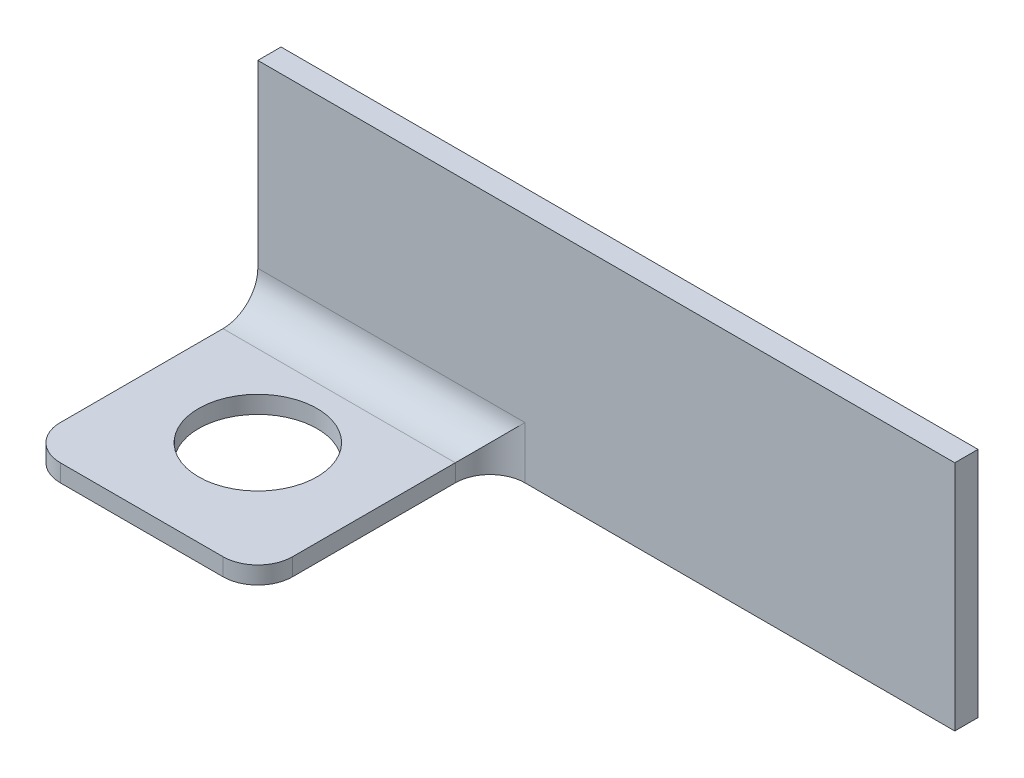
ISO-10303-21;
HEADER;
FILE_DESCRIPTION(('STEP AP214'),'2;1');
FILE_NAME('part.step','',(''),(''),'','','');
FILE_SCHEMA(('AUTOMOTIVE_DESIGN { 1 0 10303 214 1 1 1 1 }'));
ENDSEC;
DATA;
#1=APPLICATION_CONTEXT('core data for automotive mechanical design processes');
#2=APPLICATION_PROTOCOL_DEFINITION('international standard','automotive_design',2000,#1);
#3=PRODUCT_CONTEXT('',#1,'mechanical');
#4=PRODUCT('Part','Part','',(#3));
#5=PRODUCT_RELATED_PRODUCT_CATEGORY('part','',(#4));
#6=PRODUCT_DEFINITION_FORMATION('','',#4);
#7=PRODUCT_DEFINITION_CONTEXT('part definition',#1,'design');
#8=PRODUCT_DEFINITION('design','',#6,#7);
#9=PRODUCT_DEFINITION_SHAPE('','',#8);
#10=(LENGTH_UNIT() NAMED_UNIT(*) SI_UNIT(.MILLI.,.METRE.));
#11=(NAMED_UNIT(*) PLANE_ANGLE_UNIT() SI_UNIT($,.RADIAN.));
#12=(NAMED_UNIT(*) SI_UNIT($,.STERADIAN.) SOLID_ANGLE_UNIT());
#13=UNCERTAINTY_MEASURE_WITH_UNIT(LENGTH_MEASURE(1.E-05),#10,'distance_accuracy_value','');
#14=(GEOMETRIC_REPRESENTATION_CONTEXT(3) GLOBAL_UNCERTAINTY_ASSIGNED_CONTEXT((#13)) GLOBAL_UNIT_ASSIGNED_CONTEXT((#10,
#11,#12)) REPRESENTATION_CONTEXT('',''));
#15=CARTESIAN_POINT('',(0.,0.,0.));
#16=DIRECTION('',(0.,0.,1.));
#17=DIRECTION('',(1.,0.,0.));
#18=AXIS2_PLACEMENT_3D('',#15,#16,#17);
#19=CARTESIAN_POINT('',(-10.,1.5,0.));
#20=DIRECTION('',(1.,0.,0.));
#21=DIRECTION('',(0.,0.,-1.));
#22=AXIS2_PLACEMENT_3D('',#19,#20,#21);
#23=PLANE('',#22);
#24=DIRECTION('',(0.,0.,1.));
#25=VECTOR('',#24,1.);
#26=CARTESIAN_POINT('',(-10.,0.,0.));
#27=LINE('',#26,#25);
#28=CARTESIAN_POINT('',(-10.,0.,-12.));
#29=VERTEX_POINT('',#28);
#30=CARTESIAN_POINT('',(-10.,0.,7.));
#31=VERTEX_POINT('',#30);
#32=EDGE_CURVE('E144',#29,#31,#27,.T.);
#33=ORIENTED_EDGE('',*,*,#32,.T.);
#34=DIRECTION('',(0.,-1.,0.));
#35=VECTOR('',#34,1.);
#36=CARTESIAN_POINT('',(-10.,1.5,7.));
#37=LINE('',#36,#35);
#38=CARTESIAN_POINT('',(-10.,1.5,7.));
#39=VERTEX_POINT('',#38);
#40=EDGE_CURVE('E11',#31,#39,#37,.F.);
#41=ORIENTED_EDGE('',*,*,#40,.T.);
#42=DIRECTION('',(0.,0.,1.));
#43=VECTOR('',#42,1.);
#44=CARTESIAN_POINT('',(-10.,1.5,0.));
#45=LINE('',#44,#43);
#46=CARTESIAN_POINT('',(-10.,1.5,-7.));
#47=VERTEX_POINT('',#46);
#48=EDGE_CURVE('E153',#47,#39,#45,.T.);
#49=ORIENTED_EDGE('',*,*,#48,.F.);
#50=CARTESIAN_POINT('',(-10.,4.5,-7.));
#51=DIRECTION('',(1.,0.,0.));
#52=DIRECTION('',(0.,0.,-1.));
#53=AXIS2_PLACEMENT_3D('',#50,#51,#52);
#54=CIRCLE('',#53,3.);
#55=CARTESIAN_POINT('',(-10.,4.5,-10.));
#56=VERTEX_POINT('',#55);
#57=EDGE_CURVE('E172',#47,#56,#54,.T.);
#58=ORIENTED_EDGE('',*,*,#57,.T.);
#59=DIRECTION('',(0.,-1.,0.));
#60=VECTOR('',#59,1.);
#61=CARTESIAN_POINT('',(-10.,20.,-10.));
#62=LINE('',#61,#60);
#63=CARTESIAN_POINT('',(-10.,20.,-10.));
#64=VERTEX_POINT('',#63);
#65=EDGE_CURVE('E218',#64,#56,#62,.T.);
#66=ORIENTED_EDGE('',*,*,#65,.F.);
#67=DIRECTION('',(0.,0.,-1.));
#68=VECTOR('',#67,1.);
#69=CARTESIAN_POINT('',(-10.,20.,-10.));
#70=LINE('',#69,#68);
#71=CARTESIAN_POINT('',(-10.,20.,-12.));
#72=VERTEX_POINT('',#71);
#73=EDGE_CURVE('E131',#64,#72,#70,.T.);
#74=ORIENTED_EDGE('',*,*,#73,.T.);
#75=DIRECTION('',(0.,-1.,0.));
#76=VECTOR('',#75,1.);
#77=CARTESIAN_POINT('',(-10.,20.,-12.));
#78=LINE('',#77,#76);
#79=EDGE_CURVE('E146',#72,#29,#78,.T.);
#80=ORIENTED_EDGE('',*,*,#79,.T.);
#81=EDGE_LOOP('',(#33,#41,#49,#58,#66,#74,#80));
#82=FACE_BOUND('',#81,.T.);
#83=ADVANCED_FACE('F33',(#82),#23,.F.);
#84=CARTESIAN_POINT('',(0.,1.5,10.));
#85=DIRECTION('',(0.,0.,1.));
#86=DIRECTION('',(1.,0.,0.));
#87=AXIS2_PLACEMENT_3D('',#84,#85,#86);
#88=PLANE('',#87);
#89=DIRECTION('',(-1.,0.,0.));
#90=VECTOR('',#89,1.);
#91=CARTESIAN_POINT('',(0.,0.,10.));
#92=LINE('',#91,#90);
#93=CARTESIAN_POINT('',(7.,0.,10.));
#94=VERTEX_POINT('',#93);
#95=CARTESIAN_POINT('',(-7.,0.,10.));
#96=VERTEX_POINT('',#95);
#97=EDGE_CURVE('E163',#94,#96,#92,.T.);
#98=ORIENTED_EDGE('',*,*,#97,.F.);
#99=DIRECTION('',(0.,-1.,0.));
#100=VECTOR('',#99,1.);
#101=CARTESIAN_POINT('',(7.,1.5,10.));
#102=LINE('',#101,#100);
#103=CARTESIAN_POINT('',(7.,1.5,10.));
#104=VERTEX_POINT('',#103);
#105=EDGE_CURVE('E193',#94,#104,#102,.F.);
#106=ORIENTED_EDGE('',*,*,#105,.T.);
#107=DIRECTION('',(-1.,0.,0.));
#108=VECTOR('',#107,1.);
#109=CARTESIAN_POINT('',(0.,1.5,10.));
#110=LINE('',#109,#108);
#111=CARTESIAN_POINT('',(-7.,1.5,10.));
#112=VERTEX_POINT('',#111);
#113=EDGE_CURVE('E156',#104,#112,#110,.T.);
#114=ORIENTED_EDGE('',*,*,#113,.T.);
#115=DIRECTION('',(0.,-1.,0.));
#116=VECTOR('',#115,1.);
#117=CARTESIAN_POINT('',(-7.,0.,10.));
#118=LINE('',#117,#116);
#119=EDGE_CURVE('E190',#112,#96,#118,.T.);
#120=ORIENTED_EDGE('',*,*,#119,.T.);
#121=EDGE_LOOP('',(#98,#106,#114,#120));
#122=FACE_BOUND('',#121,.T.);
#123=ADVANCED_FACE('F211',(#122),#88,.T.);
#124=CARTESIAN_POINT('',(0.,1.5,0.));
#125=DIRECTION('',(0.,-1.,0.));
#126=DIRECTION('',(0.,0.,-1.));
#127=AXIS2_PLACEMENT_3D('',#124,#125,#126);
#128=CYLINDRICAL_SURFACE('',#127,5.1);
#129=CARTESIAN_POINT('',(0.,1.5,0.));
#130=DIRECTION('',(0.,1.,0.));
#131=DIRECTION('',(0.,0.,1.));
#132=AXIS2_PLACEMENT_3D('',#129,#130,#131);
#133=CIRCLE('',#132,5.1);
#134=CARTESIAN_POINT('',(0.,1.5,5.1));
#135=VERTEX_POINT('',#134);
#136=EDGE_CURVE('E150',#135,#135,#133,.T.);
#137=ORIENTED_EDGE('',*,*,#136,.T.);
#138=EDGE_LOOP('',(#137));
#139=FACE_BOUND('',#138,.T.);
#140=CARTESIAN_POINT('',(0.,0.,0.));
#141=DIRECTION('',(0.,1.,0.));
#142=DIRECTION('',(0.,0.,1.));
#143=AXIS2_PLACEMENT_3D('',#140,#141,#142);
#144=CIRCLE('',#143,5.1);
#145=CARTESIAN_POINT('',(0.,0.,5.1));
#146=VERTEX_POINT('',#145);
#147=EDGE_CURVE('E141',#146,#146,#144,.T.);
#148=ORIENTED_EDGE('',*,*,#147,.F.);
#149=EDGE_LOOP('',(#148));
#150=FACE_BOUND('',#149,.T.);
#151=ADVANCED_FACE('F246',(#139,#150),#128,.F.);
#152=CARTESIAN_POINT('',(10.,1.5,0.));
#153=DIRECTION('',(1.,0.,0.));
#154=DIRECTION('',(0.,0.,-1.));
#155=AXIS2_PLACEMENT_3D('',#152,#153,#154);
#156=PLANE('',#155);
#157=DIRECTION('',(0.,0.,1.));
#158=VECTOR('',#157,1.);
#159=CARTESIAN_POINT('',(10.,1.5,0.));
#160=LINE('',#159,#158);
#161=CARTESIAN_POINT('',(10.,1.5,-7.));
#162=VERTEX_POINT('',#161);
#163=CARTESIAN_POINT('',(10.,1.5,7.));
#164=VERTEX_POINT('',#163);
#165=EDGE_CURVE('E158',#162,#164,#160,.T.);
#166=ORIENTED_EDGE('',*,*,#165,.T.);
#167=DIRECTION('',(0.,-1.,0.));
#168=VECTOR('',#167,1.);
#169=CARTESIAN_POINT('',(10.,1.5,7.));
#170=LINE('',#169,#168);
#171=CARTESIAN_POINT('',(10.,0.,7.));
#172=VERTEX_POINT('',#171);
#173=EDGE_CURVE('E183',#164,#172,#170,.T.);
#174=ORIENTED_EDGE('',*,*,#173,.T.);
#175=DIRECTION('',(0.,0.,1.));
#176=VECTOR('',#175,1.);
#177=CARTESIAN_POINT('',(10.,0.,0.));
#178=LINE('',#177,#176);
#179=CARTESIAN_POINT('',(10.,0.,-7.));
#180=VERTEX_POINT('',#179);
#181=EDGE_CURVE('E154',#180,#172,#178,.T.);
#182=ORIENTED_EDGE('',*,*,#181,.F.);
#183=DIRECTION('',(0.,-1.,0.));
#184=VECTOR('',#183,1.);
#185=CARTESIAN_POINT('',(10.,1.5,-7.));
#186=LINE('',#185,#184);
#187=EDGE_CURVE('E176',#180,#162,#186,.F.);
#188=ORIENTED_EDGE('',*,*,#187,.T.);
#189=EDGE_LOOP('',(#166,#174,#182,#188));
#190=FACE_BOUND('',#189,.T.);
#191=ADVANCED_FACE('F203',(#190),#156,.T.);
#192=CARTESIAN_POINT('',(0.,1.5,0.));
#193=DIRECTION('',(0.,1.,0.));
#194=DIRECTION('',(0.,0.,1.));
#195=AXIS2_PLACEMENT_3D('',#192,#193,#194);
#196=PLANE('',#195);
#197=ORIENTED_EDGE('',*,*,#136,.F.);
#198=EDGE_LOOP('',(#197));
#199=FACE_BOUND('',#198,.T.);
#200=ORIENTED_EDGE('',*,*,#113,.F.);
#201=CARTESIAN_POINT('',(7.,1.5,7.));
#202=DIRECTION('',(0.,1.,0.));
#203=DIRECTION('',(0.,0.,1.));
#204=AXIS2_PLACEMENT_3D('',#201,#202,#203);
#205=CIRCLE('',#204,3.);
#206=EDGE_CURVE('E41',#104,#164,#205,.T.);
#207=ORIENTED_EDGE('',*,*,#206,.T.);
#208=ORIENTED_EDGE('',*,*,#165,.F.);
#209=DIRECTION('',(-1.,0.,0.));
#210=VECTOR('',#209,1.);
#211=CARTESIAN_POINT('',(0.,1.5,-7.));
#212=LINE('',#211,#210);
#213=EDGE_CURVE('E160',#162,#47,#212,.T.);
#214=ORIENTED_EDGE('',*,*,#213,.T.);
#215=ORIENTED_EDGE('',*,*,#48,.T.);
#216=CARTESIAN_POINT('',(-7.,1.5,7.));
#217=DIRECTION('',(0.,1.,0.));
#218=DIRECTION('',(0.,0.,1.));
#219=AXIS2_PLACEMENT_3D('',#216,#217,#218);
#220=CIRCLE('',#219,3.);
#221=EDGE_CURVE('E53',#39,#112,#220,.T.);
#222=ORIENTED_EDGE('',*,*,#221,.T.);
#223=EDGE_LOOP('',(#200,#207,#208,#214,#215,#222));
#224=FACE_BOUND('',#223,.T.);
#225=ADVANCED_FACE('F197',(#199,#224),#196,.T.);
#226=CARTESIAN_POINT('',(0.,0.,0.));
#227=DIRECTION('',(0.,1.,0.));
#228=DIRECTION('',(0.,0.,1.));
#229=AXIS2_PLACEMENT_3D('',#226,#227,#228);
#230=PLANE('',#229);
#231=ORIENTED_EDGE('',*,*,#147,.T.);
#232=EDGE_LOOP('',(#231));
#233=FACE_BOUND('',#232,.T.);
#234=ORIENTED_EDGE('',*,*,#181,.T.);
#235=CARTESIAN_POINT('',(7.,0.,7.));
#236=DIRECTION('',(0.,1.,0.));
#237=DIRECTION('',(0.,0.,1.));
#238=AXIS2_PLACEMENT_3D('',#235,#236,#237);
#239=CIRCLE('',#238,3.);
#240=EDGE_CURVE('E188',#172,#94,#239,.F.);
#241=ORIENTED_EDGE('',*,*,#240,.T.);
#242=ORIENTED_EDGE('',*,*,#97,.T.);
#243=CARTESIAN_POINT('',(-7.,0.,7.));
#244=DIRECTION('',(0.,1.,0.));
#245=DIRECTION('',(0.,0.,1.));
#246=AXIS2_PLACEMENT_3D('',#243,#244,#245);
#247=CIRCLE('',#246,3.);
#248=EDGE_CURVE('E186',#96,#31,#247,.F.);
#249=ORIENTED_EDGE('',*,*,#248,.T.);
#250=ORIENTED_EDGE('',*,*,#32,.F.);
#251=DIRECTION('',(1.,0.,0.));
#252=VECTOR('',#251,1.);
#253=CARTESIAN_POINT('',(-10.,0.,-12.));
#254=LINE('',#253,#252);
#255=CARTESIAN_POINT('',(50.,0.,-12.));
#256=VERTEX_POINT('',#255);
#257=EDGE_CURVE('E134',#29,#256,#254,.T.);
#258=ORIENTED_EDGE('',*,*,#257,.T.);
#259=DIRECTION('',(0.,0.,-1.));
#260=VECTOR('',#259,1.);
#261=CARTESIAN_POINT('',(50.,0.,-10.));
#262=LINE('',#261,#260);
#263=CARTESIAN_POINT('',(50.,0.,-10.));
#264=VERTEX_POINT('',#263);
#265=EDGE_CURVE('E220',#264,#256,#262,.T.);
#266=ORIENTED_EDGE('',*,*,#265,.F.);
#267=DIRECTION('',(1.,0.,0.));
#268=VECTOR('',#267,1.);
#269=CARTESIAN_POINT('',(-10.,0.,-10.));
#270=LINE('',#269,#268);
#271=CARTESIAN_POINT('',(13.,0.,-10.));
#272=VERTEX_POINT('',#271);
#273=EDGE_CURVE('E139',#272,#264,#270,.T.);
#274=ORIENTED_EDGE('',*,*,#273,.F.);
#275=CARTESIAN_POINT('',(13.,0.,-7.));
#276=DIRECTION('',(0.,1.,0.));
#277=DIRECTION('',(0.,0.,1.));
#278=AXIS2_PLACEMENT_3D('',#275,#276,#277);
#279=CIRCLE('',#278,3.);
#280=EDGE_CURVE('E178',#272,#180,#279,.T.);
#281=ORIENTED_EDGE('',*,*,#280,.T.);
#282=EDGE_LOOP('',(#234,#241,#242,#249,#250,#258,#266,#274,#281));
#283=FACE_BOUND('',#282,.T.);
#284=ADVANCED_FACE('F209',(#233,#283),#230,.F.);
#285=CARTESIAN_POINT('',(-10.,20.,-10.));
#286=DIRECTION('',(0.,0.,-1.));
#287=DIRECTION('',(-1.,0.,0.));
#288=AXIS2_PLACEMENT_3D('',#285,#286,#287);
#289=PLANE('',#288);
#290=DIRECTION('',(-1.,0.,0.));
#291=VECTOR('',#290,1.);
#292=CARTESIAN_POINT('',(-10.,4.5,-10.));
#293=LINE('',#292,#291);
#294=CARTESIAN_POINT('',(13.,4.5,-10.));
#295=VERTEX_POINT('',#294);
#296=EDGE_CURVE('E170',#56,#295,#293,.F.);
#297=ORIENTED_EDGE('',*,*,#296,.T.);
#298=DIRECTION('',(0.,-1.,0.));
#299=VECTOR('',#298,1.);
#300=CARTESIAN_POINT('',(13.,20.,-10.));
#301=LINE('',#300,#299);
#302=EDGE_CURVE('E174',#295,#272,#301,.T.);
#303=ORIENTED_EDGE('',*,*,#302,.T.);
#304=ORIENTED_EDGE('',*,*,#273,.T.);
#305=DIRECTION('',(0.,-1.,0.));
#306=VECTOR('',#305,1.);
#307=CARTESIAN_POINT('',(50.,20.,-10.));
#308=LINE('',#307,#306);
#309=CARTESIAN_POINT('',(50.,20.,-10.));
#310=VERTEX_POINT('',#309);
#311=EDGE_CURVE('E119',#310,#264,#308,.T.);
#312=ORIENTED_EDGE('',*,*,#311,.F.);
#313=DIRECTION('',(1.,0.,0.));
#314=VECTOR('',#313,1.);
#315=CARTESIAN_POINT('',(-10.,20.,-10.));
#316=LINE('',#315,#314);
#317=EDGE_CURVE('E125',#64,#310,#316,.T.);
#318=ORIENTED_EDGE('',*,*,#317,.F.);
#319=ORIENTED_EDGE('',*,*,#65,.T.);
#320=EDGE_LOOP('',(#297,#303,#304,#312,#318,#319));
#321=FACE_BOUND('',#320,.T.);
#322=ADVANCED_FACE('F136',(#321),#289,.F.);
#323=CARTESIAN_POINT('',(50.,20.,-10.));
#324=DIRECTION('',(-1.,0.,0.));
#325=DIRECTION('',(0.,0.,1.));
#326=AXIS2_PLACEMENT_3D('',#323,#324,#325);
#327=PLANE('',#326);
#328=ORIENTED_EDGE('',*,*,#265,.T.);
#329=DIRECTION('',(0.,-1.,0.));
#330=VECTOR('',#329,1.);
#331=CARTESIAN_POINT('',(50.,20.,-12.));
#332=LINE('',#331,#330);
#333=CARTESIAN_POINT('',(50.,20.,-12.));
#334=VERTEX_POINT('',#333);
#335=EDGE_CURVE('E120',#334,#256,#332,.T.);
#336=ORIENTED_EDGE('',*,*,#335,.F.);
#337=DIRECTION('',(0.,0.,-1.));
#338=VECTOR('',#337,1.);
#339=CARTESIAN_POINT('',(50.,20.,-10.));
#340=LINE('',#339,#338);
#341=EDGE_CURVE('E114',#310,#334,#340,.T.);
#342=ORIENTED_EDGE('',*,*,#341,.F.);
#343=ORIENTED_EDGE('',*,*,#311,.T.);
#344=EDGE_LOOP('',(#328,#336,#342,#343));
#345=FACE_BOUND('',#344,.T.);
#346=ADVANCED_FACE('F117',(#345),#327,.F.);
#347=CARTESIAN_POINT('',(-10.,20.,-12.));
#348=DIRECTION('',(0.,0.,-1.));
#349=DIRECTION('',(-1.,0.,0.));
#350=AXIS2_PLACEMENT_3D('',#347,#348,#349);
#351=PLANE('',#350);
#352=ORIENTED_EDGE('',*,*,#257,.F.);
#353=ORIENTED_EDGE('',*,*,#79,.F.);
#354=DIRECTION('',(1.,0.,0.));
#355=VECTOR('',#354,1.);
#356=CARTESIAN_POINT('',(-10.,20.,-12.));
#357=LINE('',#356,#355);
#358=EDGE_CURVE('E124',#72,#334,#357,.T.);
#359=ORIENTED_EDGE('',*,*,#358,.T.);
#360=ORIENTED_EDGE('',*,*,#335,.T.);
#361=EDGE_LOOP('',(#352,#353,#359,#360));
#362=FACE_BOUND('',#361,.T.);
#363=ADVANCED_FACE('F219',(#362),#351,.T.);
#364=CARTESIAN_POINT('',(0.,20.,0.));
#365=DIRECTION('',(0.,1.,0.));
#366=DIRECTION('',(0.,0.,1.));
#367=AXIS2_PLACEMENT_3D('',#364,#365,#366);
#368=PLANE('',#367);
#369=ORIENTED_EDGE('',*,*,#317,.T.);
#370=ORIENTED_EDGE('',*,*,#341,.T.);
#371=ORIENTED_EDGE('',*,*,#358,.F.);
#372=ORIENTED_EDGE('',*,*,#73,.F.);
#373=EDGE_LOOP('',(#369,#370,#371,#372));
#374=FACE_BOUND('',#373,.T.);
#375=ADVANCED_FACE('F129',(#374),#368,.T.);
#376=CARTESIAN_POINT('',(0.,4.5,-7.));
#377=DIRECTION('',(-1.,0.,0.));
#378=DIRECTION('',(0.,0.,1.));
#379=AXIS2_PLACEMENT_3D('',#376,#377,#378);
#380=CYLINDRICAL_SURFACE('',#379,3.);
#381=ORIENTED_EDGE('',*,*,#213,.F.);
#382=CARTESIAN_POINT('',(13.,4.5,-7.));
#383=DIRECTION('',(-0.707106781186547,0.707106781186547,0.));
#384=DIRECTION('',(-0.707106781186547,-0.707106781186547,0.));
#385=AXIS2_PLACEMENT_3D('',#382,#383,#384);
#386=ELLIPSE('',#385,4.24264068711928,3.);
#387=EDGE_CURVE('E180',#162,#295,#386,.F.);
#388=ORIENTED_EDGE('',*,*,#387,.T.);
#389=ORIENTED_EDGE('',*,*,#296,.F.);
#390=ORIENTED_EDGE('',*,*,#57,.F.);
#391=EDGE_LOOP('',(#381,#388,#389,#390));
#392=FACE_BOUND('',#391,.T.);
#393=ADVANCED_FACE('F229',(#392),#380,.F.);
#394=CARTESIAN_POINT('',(13.,20.,-7.));
#395=DIRECTION('',(0.,-1.,0.));
#396=DIRECTION('',(0.,0.,-1.));
#397=AXIS2_PLACEMENT_3D('',#394,#395,#396);
#398=CYLINDRICAL_SURFACE('',#397,3.);
#399=ORIENTED_EDGE('',*,*,#387,.F.);
#400=ORIENTED_EDGE('',*,*,#187,.F.);
#401=ORIENTED_EDGE('',*,*,#280,.F.);
#402=ORIENTED_EDGE('',*,*,#302,.F.);
#403=EDGE_LOOP('',(#399,#400,#401,#402));
#404=FACE_BOUND('',#403,.T.);
#405=ADVANCED_FACE('F233',(#404),#398,.F.);
#406=CARTESIAN_POINT('',(7.,1.5,7.));
#407=DIRECTION('',(0.,-1.,0.));
#408=DIRECTION('',(0.,0.,-1.));
#409=AXIS2_PLACEMENT_3D('',#406,#407,#408);
#410=CYLINDRICAL_SURFACE('',#409,3.);
#411=ORIENTED_EDGE('',*,*,#206,.F.);
#412=ORIENTED_EDGE('',*,*,#105,.F.);
#413=ORIENTED_EDGE('',*,*,#240,.F.);
#414=ORIENTED_EDGE('',*,*,#173,.F.);
#415=EDGE_LOOP('',(#411,#412,#413,#414));
#416=FACE_BOUND('',#415,.T.);
#417=ADVANCED_FACE('F206',(#416),#410,.T.);
#418=CARTESIAN_POINT('',(-7.,1.5,7.));
#419=DIRECTION('',(0.,1.,0.));
#420=DIRECTION('',(0.,0.,1.));
#421=AXIS2_PLACEMENT_3D('',#418,#419,#420);
#422=CYLINDRICAL_SURFACE('',#421,3.);
#423=ORIENTED_EDGE('',*,*,#221,.F.);
#424=ORIENTED_EDGE('',*,*,#40,.F.);
#425=ORIENTED_EDGE('',*,*,#248,.F.);
#426=ORIENTED_EDGE('',*,*,#119,.F.);
#427=EDGE_LOOP('',(#423,#424,#425,#426));
#428=FACE_BOUND('',#427,.T.);
#429=ADVANCED_FACE('F35',(#428),#422,.T.);
#430=CLOSED_SHELL('',(#83,#123,#151,#191,#225,#284,#322,#346,#363,#375,#393,#405,#417,#429));
#431=MANIFOLD_SOLID_BREP('B2',#430);
#432=ADVANCED_BREP_SHAPE_REPRESENTATION('',(#18,#431),#14);
#433=SHAPE_DEFINITION_REPRESENTATION(#9,#432);
ENDSEC;
END-ISO-10303-21;
